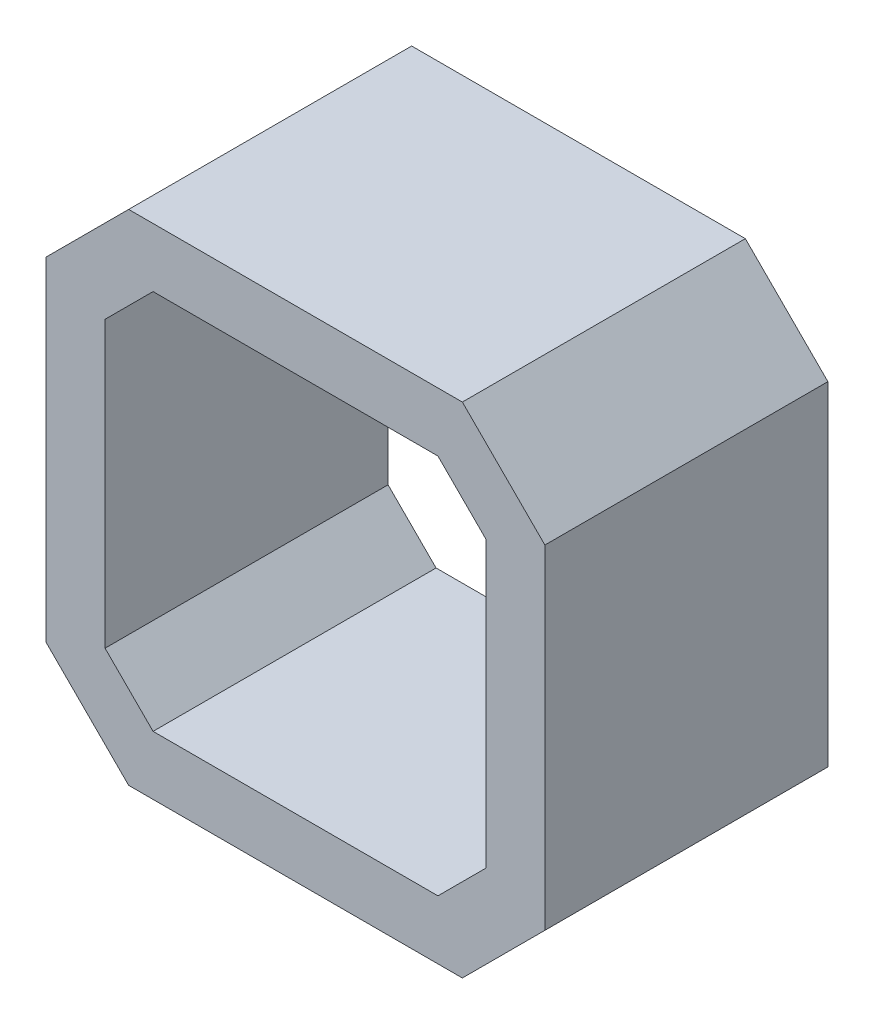
ISO-10303-21;
HEADER;
FILE_DESCRIPTION(('STEP AP214'),'2;1');
FILE_NAME('part.step','',(''),(''),'','','');
FILE_SCHEMA(('AUTOMOTIVE_DESIGN { 1 0 10303 214 1 1 1 1 }'));
ENDSEC;
DATA;
#1=APPLICATION_CONTEXT('core data for automotive mechanical design processes');
#2=APPLICATION_PROTOCOL_DEFINITION('international standard','automotive_design',2000,#1);
#3=PRODUCT_CONTEXT('',#1,'mechanical');
#4=PRODUCT('Part','Part','',(#3));
#5=PRODUCT_RELATED_PRODUCT_CATEGORY('part','',(#4));
#6=PRODUCT_DEFINITION_FORMATION('','',#4);
#7=PRODUCT_DEFINITION_CONTEXT('part definition',#1,'design');
#8=PRODUCT_DEFINITION('design','',#6,#7);
#9=PRODUCT_DEFINITION_SHAPE('','',#8);
#10=(LENGTH_UNIT() NAMED_UNIT(*) SI_UNIT(.MILLI.,.METRE.));
#11=(NAMED_UNIT(*) PLANE_ANGLE_UNIT() SI_UNIT($,.RADIAN.));
#12=(NAMED_UNIT(*) SI_UNIT($,.STERADIAN.) SOLID_ANGLE_UNIT());
#13=UNCERTAINTY_MEASURE_WITH_UNIT(LENGTH_MEASURE(1.E-05),#10,'distance_accuracy_value','');
#14=(GEOMETRIC_REPRESENTATION_CONTEXT(3) GLOBAL_UNCERTAINTY_ASSIGNED_CONTEXT((#13)) GLOBAL_UNIT_ASSIGNED_CONTEXT((#10,
#11,#12)) REPRESENTATION_CONTEXT('',''));
#15=CARTESIAN_POINT('',(0.,0.,0.));
#16=DIRECTION('',(0.,0.,1.));
#17=DIRECTION('',(1.,0.,0.));
#18=AXIS2_PLACEMENT_3D('',#15,#16,#17);
#19=CARTESIAN_POINT('',(0.,0.,24.));
#20=DIRECTION('',(0.,0.,-1.));
#21=DIRECTION('',(-1.,0.,0.));
#22=AXIS2_PLACEMENT_3D('',#19,#20,#21);
#23=PLANE('',#22);
#24=DIRECTION('',(-1.,0.,0.));
#25=VECTOR('',#24,1.);
#26=CARTESIAN_POINT('',(-14.15,21.15,24.));
#27=LINE('',#26,#25);
#28=CARTESIAN_POINT('',(14.15,21.15,24.));
#29=VERTEX_POINT('',#28);
#30=CARTESIAN_POINT('',(-14.15,21.15,24.));
#31=VERTEX_POINT('',#30);
#32=EDGE_CURVE('E236',#29,#31,#27,.T.);
#33=ORIENTED_EDGE('',*,*,#32,.T.);
#34=DIRECTION('',(-0.707106781186547,-0.707106781186547,0.));
#35=VECTOR('',#34,1.);
#36=CARTESIAN_POINT('',(-21.15,14.15,24.));
#37=LINE('',#36,#35);
#38=CARTESIAN_POINT('',(-21.15,14.15,24.));
#39=VERTEX_POINT('',#38);
#40=EDGE_CURVE('E240',#31,#39,#37,.T.);
#41=ORIENTED_EDGE('',*,*,#40,.T.);
#42=DIRECTION('',(0.,-1.,0.));
#43=VECTOR('',#42,1.);
#44=CARTESIAN_POINT('',(-21.15,14.15,24.));
#45=LINE('',#44,#43);
#46=CARTESIAN_POINT('',(-21.15,-14.15,24.));
#47=VERTEX_POINT('',#46);
#48=EDGE_CURVE('E244',#39,#47,#45,.T.);
#49=ORIENTED_EDGE('',*,*,#48,.T.);
#50=DIRECTION('',(0.707106781186547,-0.707106781186547,0.));
#51=VECTOR('',#50,1.);
#52=CARTESIAN_POINT('',(-21.15,-14.15,24.));
#53=LINE('',#52,#51);
#54=CARTESIAN_POINT('',(-14.15,-21.15,24.));
#55=VERTEX_POINT('',#54);
#56=EDGE_CURVE('E247',#47,#55,#53,.T.);
#57=ORIENTED_EDGE('',*,*,#56,.T.);
#58=DIRECTION('',(1.,0.,0.));
#59=VECTOR('',#58,1.);
#60=CARTESIAN_POINT('',(-14.15,-21.15,24.));
#61=LINE('',#60,#59);
#62=CARTESIAN_POINT('',(14.15,-21.15,24.));
#63=VERTEX_POINT('',#62);
#64=EDGE_CURVE('E250',#55,#63,#61,.T.);
#65=ORIENTED_EDGE('',*,*,#64,.T.);
#66=DIRECTION('',(0.707106781186547,0.707106781186547,0.));
#67=VECTOR('',#66,1.);
#68=CARTESIAN_POINT('',(14.15,-21.15,24.));
#69=LINE('',#68,#67);
#70=CARTESIAN_POINT('',(21.15,-14.15,24.));
#71=VERTEX_POINT('',#70);
#72=EDGE_CURVE('E253',#63,#71,#69,.T.);
#73=ORIENTED_EDGE('',*,*,#72,.T.);
#74=DIRECTION('',(0.,1.,0.));
#75=VECTOR('',#74,1.);
#76=CARTESIAN_POINT('',(21.15,14.15,24.));
#77=LINE('',#76,#75);
#78=CARTESIAN_POINT('',(21.15,14.15,24.));
#79=VERTEX_POINT('',#78);
#80=EDGE_CURVE('E256',#71,#79,#77,.T.);
#81=ORIENTED_EDGE('',*,*,#80,.T.);
#82=DIRECTION('',(-0.707106781186547,0.707106781186547,0.));
#83=VECTOR('',#82,1.);
#84=CARTESIAN_POINT('',(14.15,21.15,24.));
#85=LINE('',#84,#83);
#86=EDGE_CURVE('E259',#79,#29,#85,.T.);
#87=ORIENTED_EDGE('',*,*,#86,.T.);
#88=EDGE_LOOP('',(#33,#41,#49,#57,#65,#73,#81,#87));
#89=FACE_BOUND('',#88,.T.);
#90=DIRECTION('',(-0.707106781186547,-0.707106781186547,0.));
#91=VECTOR('',#90,1.);
#92=CARTESIAN_POINT('',(-16.15,12.0789321881345,24.));
#93=LINE('',#92,#91);
#94=CARTESIAN_POINT('',(-12.0789321881345,16.15,24.));
#95=VERTEX_POINT('',#94);
#96=CARTESIAN_POINT('',(-16.15,12.0789321881345,24.));
#97=VERTEX_POINT('',#96);
#98=EDGE_CURVE('E146',#95,#97,#93,.T.);
#99=ORIENTED_EDGE('',*,*,#98,.F.);
#100=DIRECTION('',(-1.,0.,0.));
#101=VECTOR('',#100,1.);
#102=CARTESIAN_POINT('',(-12.0789321881345,16.15,24.));
#103=LINE('',#102,#101);
#104=CARTESIAN_POINT('',(12.0789321881345,16.15,24.));
#105=VERTEX_POINT('',#104);
#106=EDGE_CURVE('E188',#105,#95,#103,.T.);
#107=ORIENTED_EDGE('',*,*,#106,.F.);
#108=DIRECTION('',(-0.707106781186547,0.707106781186547,0.));
#109=VECTOR('',#108,1.);
#110=CARTESIAN_POINT('',(12.0789321881345,16.15,24.));
#111=LINE('',#110,#109);
#112=CARTESIAN_POINT('',(16.15,12.0789321881345,24.));
#113=VERTEX_POINT('',#112);
#114=EDGE_CURVE('E185',#113,#105,#111,.T.);
#115=ORIENTED_EDGE('',*,*,#114,.F.);
#116=DIRECTION('',(0.,1.,0.));
#117=VECTOR('',#116,1.);
#118=CARTESIAN_POINT('',(16.15,12.0789321881345,24.));
#119=LINE('',#118,#117);
#120=CARTESIAN_POINT('',(16.15,-12.0789321881345,24.));
#121=VERTEX_POINT('',#120);
#122=EDGE_CURVE('E182',#121,#113,#119,.T.);
#123=ORIENTED_EDGE('',*,*,#122,.F.);
#124=DIRECTION('',(0.707106781186548,0.707106781186548,0.));
#125=VECTOR('',#124,1.);
#126=CARTESIAN_POINT('',(12.0789321881345,-16.15,24.));
#127=LINE('',#126,#125);
#128=CARTESIAN_POINT('',(12.0789321881345,-16.15,24.));
#129=VERTEX_POINT('',#128);
#130=EDGE_CURVE('E179',#129,#121,#127,.T.);
#131=ORIENTED_EDGE('',*,*,#130,.F.);
#132=DIRECTION('',(1.,0.,0.));
#133=VECTOR('',#132,1.);
#134=CARTESIAN_POINT('',(-12.0789321881345,-16.15,24.));
#135=LINE('',#134,#133);
#136=CARTESIAN_POINT('',(-12.0789321881345,-16.15,24.));
#137=VERTEX_POINT('',#136);
#138=EDGE_CURVE('E174',#137,#129,#135,.T.);
#139=ORIENTED_EDGE('',*,*,#138,.F.);
#140=DIRECTION('',(0.707106781186548,-0.707106781186548,0.));
#141=VECTOR('',#140,1.);
#142=CARTESIAN_POINT('',(-16.15,-12.0789321881345,24.));
#143=LINE('',#142,#141);
#144=CARTESIAN_POINT('',(-16.15,-12.0789321881345,24.));
#145=VERTEX_POINT('',#144);
#146=EDGE_CURVE('E169',#145,#137,#143,.T.);
#147=ORIENTED_EDGE('',*,*,#146,.F.);
#148=DIRECTION('',(0.,-1.,0.));
#149=VECTOR('',#148,1.);
#150=CARTESIAN_POINT('',(-16.15,12.0789321881345,24.));
#151=LINE('',#150,#149);
#152=EDGE_CURVE('E155',#97,#145,#151,.T.);
#153=ORIENTED_EDGE('',*,*,#152,.F.);
#154=EDGE_LOOP('',(#99,#107,#115,#123,#131,#139,#147,#153));
#155=FACE_BOUND('',#154,.T.);
#156=ADVANCED_FACE('F32',(#89,#155),#23,.F.);
#157=CARTESIAN_POINT('',(0.,0.,0.));
#158=DIRECTION('',(0.,0.,-1.));
#159=DIRECTION('',(-1.,0.,0.));
#160=AXIS2_PLACEMENT_3D('',#157,#158,#159);
#161=PLANE('',#160);
#162=DIRECTION('',(-1.,0.,0.));
#163=VECTOR('',#162,1.);
#164=CARTESIAN_POINT('',(-14.15,21.15,0.));
#165=LINE('',#164,#163);
#166=CARTESIAN_POINT('',(14.15,21.15,0.));
#167=VERTEX_POINT('',#166);
#168=CARTESIAN_POINT('',(-14.15,21.15,0.));
#169=VERTEX_POINT('',#168);
#170=EDGE_CURVE('E164',#167,#169,#165,.T.);
#171=ORIENTED_EDGE('',*,*,#170,.F.);
#172=DIRECTION('',(-0.707106781186547,0.707106781186547,0.));
#173=VECTOR('',#172,1.);
#174=CARTESIAN_POINT('',(14.15,21.15,0.));
#175=LINE('',#174,#173);
#176=CARTESIAN_POINT('',(21.15,14.15,0.));
#177=VERTEX_POINT('',#176);
#178=EDGE_CURVE('E241',#177,#167,#175,.T.);
#179=ORIENTED_EDGE('',*,*,#178,.F.);
#180=DIRECTION('',(0.,1.,0.));
#181=VECTOR('',#180,1.);
#182=CARTESIAN_POINT('',(21.15,14.15,0.));
#183=LINE('',#182,#181);
#184=CARTESIAN_POINT('',(21.15,-14.15,0.));
#185=VERTEX_POINT('',#184);
#186=EDGE_CURVE('E281',#185,#177,#183,.T.);
#187=ORIENTED_EDGE('',*,*,#186,.F.);
#188=DIRECTION('',(0.707106781186547,0.707106781186547,0.));
#189=VECTOR('',#188,1.);
#190=CARTESIAN_POINT('',(14.15,-21.15,0.));
#191=LINE('',#190,#189);
#192=CARTESIAN_POINT('',(14.15,-21.15,0.));
#193=VERTEX_POINT('',#192);
#194=EDGE_CURVE('E278',#193,#185,#191,.T.);
#195=ORIENTED_EDGE('',*,*,#194,.F.);
#196=DIRECTION('',(1.,0.,0.));
#197=VECTOR('',#196,1.);
#198=CARTESIAN_POINT('',(-14.15,-21.15,0.));
#199=LINE('',#198,#197);
#200=CARTESIAN_POINT('',(-14.15,-21.15,0.));
#201=VERTEX_POINT('',#200);
#202=EDGE_CURVE('E275',#201,#193,#199,.T.);
#203=ORIENTED_EDGE('',*,*,#202,.F.);
#204=DIRECTION('',(0.707106781186547,-0.707106781186547,0.));
#205=VECTOR('',#204,1.);
#206=CARTESIAN_POINT('',(-21.15,-14.15,0.));
#207=LINE('',#206,#205);
#208=CARTESIAN_POINT('',(-21.15,-14.15,0.));
#209=VERTEX_POINT('',#208);
#210=EDGE_CURVE('E272',#209,#201,#207,.T.);
#211=ORIENTED_EDGE('',*,*,#210,.F.);
#212=DIRECTION('',(0.,-1.,0.));
#213=VECTOR('',#212,1.);
#214=CARTESIAN_POINT('',(-21.15,14.15,0.));
#215=LINE('',#214,#213);
#216=CARTESIAN_POINT('',(-21.15,14.15,0.));
#217=VERTEX_POINT('',#216);
#218=EDGE_CURVE('E269',#217,#209,#215,.T.);
#219=ORIENTED_EDGE('',*,*,#218,.F.);
#220=DIRECTION('',(-0.707106781186547,-0.707106781186547,0.));
#221=VECTOR('',#220,1.);
#222=CARTESIAN_POINT('',(-21.15,14.15,0.));
#223=LINE('',#222,#221);
#224=EDGE_CURVE('E266',#169,#217,#223,.T.);
#225=ORIENTED_EDGE('',*,*,#224,.F.);
#226=EDGE_LOOP('',(#171,#179,#187,#195,#203,#211,#219,#225));
#227=FACE_BOUND('',#226,.T.);
#228=DIRECTION('',(-1.,0.,0.));
#229=VECTOR('',#228,1.);
#230=CARTESIAN_POINT('',(-12.0789321881345,16.15,0.));
#231=LINE('',#230,#229);
#232=CARTESIAN_POINT('',(12.0789321881345,16.15,0.));
#233=VERTEX_POINT('',#232);
#234=CARTESIAN_POINT('',(-12.0789321881345,16.15,0.));
#235=VERTEX_POINT('',#234);
#236=EDGE_CURVE('E156',#233,#235,#231,.T.);
#237=ORIENTED_EDGE('',*,*,#236,.T.);
#238=DIRECTION('',(-0.707106781186547,-0.707106781186547,0.));
#239=VECTOR('',#238,1.);
#240=CARTESIAN_POINT('',(-16.15,12.0789321881345,0.));
#241=LINE('',#240,#239);
#242=CARTESIAN_POINT('',(-16.15,12.0789321881345,0.));
#243=VERTEX_POINT('',#242);
#244=EDGE_CURVE('E56',#235,#243,#241,.T.);
#245=ORIENTED_EDGE('',*,*,#244,.T.);
#246=DIRECTION('',(0.,-1.,0.));
#247=VECTOR('',#246,1.);
#248=CARTESIAN_POINT('',(-16.15,12.0789321881345,0.));
#249=LINE('',#248,#247);
#250=CARTESIAN_POINT('',(-16.15,-12.0789321881345,0.));
#251=VERTEX_POINT('',#250);
#252=EDGE_CURVE('E162',#243,#251,#249,.T.);
#253=ORIENTED_EDGE('',*,*,#252,.T.);
#254=DIRECTION('',(0.707106781186548,-0.707106781186548,0.));
#255=VECTOR('',#254,1.);
#256=CARTESIAN_POINT('',(-16.15,-12.0789321881345,0.));
#257=LINE('',#256,#255);
#258=CARTESIAN_POINT('',(-12.0789321881345,-16.15,0.));
#259=VERTEX_POINT('',#258);
#260=EDGE_CURVE('E195',#251,#259,#257,.T.);
#261=ORIENTED_EDGE('',*,*,#260,.T.);
#262=DIRECTION('',(1.,0.,0.));
#263=VECTOR('',#262,1.);
#264=CARTESIAN_POINT('',(-12.0789321881345,-16.15,0.));
#265=LINE('',#264,#263);
#266=CARTESIAN_POINT('',(12.0789321881345,-16.15,0.));
#267=VERTEX_POINT('',#266);
#268=EDGE_CURVE('E199',#259,#267,#265,.T.);
#269=ORIENTED_EDGE('',*,*,#268,.T.);
#270=DIRECTION('',(0.707106781186548,0.707106781186548,0.));
#271=VECTOR('',#270,1.);
#272=CARTESIAN_POINT('',(12.0789321881345,-16.15,0.));
#273=LINE('',#272,#271);
#274=CARTESIAN_POINT('',(16.15,-12.0789321881345,0.));
#275=VERTEX_POINT('',#274);
#276=EDGE_CURVE('E203',#267,#275,#273,.T.);
#277=ORIENTED_EDGE('',*,*,#276,.T.);
#278=DIRECTION('',(0.,1.,0.));
#279=VECTOR('',#278,1.);
#280=CARTESIAN_POINT('',(16.15,12.0789321881345,0.));
#281=LINE('',#280,#279);
#282=CARTESIAN_POINT('',(16.15,12.0789321881345,0.));
#283=VERTEX_POINT('',#282);
#284=EDGE_CURVE('E207',#275,#283,#281,.T.);
#285=ORIENTED_EDGE('',*,*,#284,.T.);
#286=DIRECTION('',(-0.707106781186547,0.707106781186547,0.));
#287=VECTOR('',#286,1.);
#288=CARTESIAN_POINT('',(12.0789321881345,16.15,0.));
#289=LINE('',#288,#287);
#290=EDGE_CURVE('E211',#283,#233,#289,.T.);
#291=ORIENTED_EDGE('',*,*,#290,.T.);
#292=EDGE_LOOP('',(#237,#245,#253,#261,#269,#277,#285,#291));
#293=FACE_BOUND('',#292,.T.);
#294=ADVANCED_FACE('F321',(#227,#293),#161,.T.);
#295=CARTESIAN_POINT('',(-14.15,21.15,24.));
#296=DIRECTION('',(0.,-1.,0.));
#297=DIRECTION('',(0.,0.,-1.));
#298=AXIS2_PLACEMENT_3D('',#295,#296,#297);
#299=PLANE('',#298);
#300=ORIENTED_EDGE('',*,*,#170,.T.);
#301=DIRECTION('',(0.,0.,-1.));
#302=VECTOR('',#301,1.);
#303=CARTESIAN_POINT('',(-14.15,21.15,24.));
#304=LINE('',#303,#302);
#305=EDGE_CURVE('E11',#31,#169,#304,.T.);
#306=ORIENTED_EDGE('',*,*,#305,.F.);
#307=ORIENTED_EDGE('',*,*,#32,.F.);
#308=DIRECTION('',(0.,0.,-1.));
#309=VECTOR('',#308,1.);
#310=CARTESIAN_POINT('',(14.15,21.15,24.));
#311=LINE('',#310,#309);
#312=EDGE_CURVE('E262',#29,#167,#311,.T.);
#313=ORIENTED_EDGE('',*,*,#312,.T.);
#314=EDGE_LOOP('',(#300,#306,#307,#313));
#315=FACE_BOUND('',#314,.T.);
#316=ADVANCED_FACE('F34',(#315),#299,.F.);
#317=CARTESIAN_POINT('',(-21.15,14.15,24.));
#318=DIRECTION('',(0.707106781186548,-0.707106781186548,0.));
#319=DIRECTION('',(0.707106781186548,0.707106781186548,0.));
#320=AXIS2_PLACEMENT_3D('',#317,#318,#319);
#321=PLANE('',#320);
#322=ORIENTED_EDGE('',*,*,#224,.T.);
#323=DIRECTION('',(0.,0.,-1.));
#324=VECTOR('',#323,1.);
#325=CARTESIAN_POINT('',(-21.15,14.15,24.));
#326=LINE('',#325,#324);
#327=EDGE_CURVE('E41',#39,#217,#326,.T.);
#328=ORIENTED_EDGE('',*,*,#327,.F.);
#329=ORIENTED_EDGE('',*,*,#40,.F.);
#330=ORIENTED_EDGE('',*,*,#305,.T.);
#331=EDGE_LOOP('',(#322,#328,#329,#330));
#332=FACE_BOUND('',#331,.T.);
#333=ADVANCED_FACE('F338',(#332),#321,.F.);
#334=CARTESIAN_POINT('',(-21.15,14.15,24.));
#335=DIRECTION('',(1.,0.,0.));
#336=DIRECTION('',(0.,1.,0.));
#337=AXIS2_PLACEMENT_3D('',#334,#335,#336);
#338=PLANE('',#337);
#339=ORIENTED_EDGE('',*,*,#218,.T.);
#340=DIRECTION('',(0.,0.,-1.));
#341=VECTOR('',#340,1.);
#342=CARTESIAN_POINT('',(-21.15,-14.15,24.));
#343=LINE('',#342,#341);
#344=EDGE_CURVE('E305',#47,#209,#343,.T.);
#345=ORIENTED_EDGE('',*,*,#344,.F.);
#346=ORIENTED_EDGE('',*,*,#48,.F.);
#347=ORIENTED_EDGE('',*,*,#327,.T.);
#348=EDGE_LOOP('',(#339,#345,#346,#347));
#349=FACE_BOUND('',#348,.T.);
#350=ADVANCED_FACE('F315',(#349),#338,.F.);
#351=CARTESIAN_POINT('',(-21.15,-14.15,24.));
#352=DIRECTION('',(0.707106781186548,0.707106781186548,0.));
#353=DIRECTION('',(-0.707106781186548,0.707106781186548,0.));
#354=AXIS2_PLACEMENT_3D('',#351,#352,#353);
#355=PLANE('',#354);
#356=ORIENTED_EDGE('',*,*,#210,.T.);
#357=DIRECTION('',(0.,0.,-1.));
#358=VECTOR('',#357,1.);
#359=CARTESIAN_POINT('',(-14.15,-21.15,24.));
#360=LINE('',#359,#358);
#361=EDGE_CURVE('E301',#55,#201,#360,.T.);
#362=ORIENTED_EDGE('',*,*,#361,.F.);
#363=ORIENTED_EDGE('',*,*,#56,.F.);
#364=ORIENTED_EDGE('',*,*,#344,.T.);
#365=EDGE_LOOP('',(#356,#362,#363,#364));
#366=FACE_BOUND('',#365,.T.);
#367=ADVANCED_FACE('F327',(#366),#355,.F.);
#368=CARTESIAN_POINT('',(-14.15,-21.15,24.));
#369=DIRECTION('',(0.,1.,0.));
#370=DIRECTION('',(0.,0.,1.));
#371=AXIS2_PLACEMENT_3D('',#368,#369,#370);
#372=PLANE('',#371);
#373=ORIENTED_EDGE('',*,*,#202,.T.);
#374=DIRECTION('',(0.,0.,-1.));
#375=VECTOR('',#374,1.);
#376=CARTESIAN_POINT('',(14.15,-21.15,24.));
#377=LINE('',#376,#375);
#378=EDGE_CURVE('E297',#63,#193,#377,.T.);
#379=ORIENTED_EDGE('',*,*,#378,.F.);
#380=ORIENTED_EDGE('',*,*,#64,.F.);
#381=ORIENTED_EDGE('',*,*,#361,.T.);
#382=EDGE_LOOP('',(#373,#379,#380,#381));
#383=FACE_BOUND('',#382,.T.);
#384=ADVANCED_FACE('F331',(#383),#372,.F.);
#385=CARTESIAN_POINT('',(14.15,-21.15,24.));
#386=DIRECTION('',(-0.707106781186548,0.707106781186548,0.));
#387=DIRECTION('',(-0.707106781186548,-0.707106781186548,0.));
#388=AXIS2_PLACEMENT_3D('',#385,#386,#387);
#389=PLANE('',#388);
#390=ORIENTED_EDGE('',*,*,#194,.T.);
#391=DIRECTION('',(0.,0.,-1.));
#392=VECTOR('',#391,1.);
#393=CARTESIAN_POINT('',(21.15,-14.15,24.));
#394=LINE('',#393,#392);
#395=EDGE_CURVE('E293',#71,#185,#394,.T.);
#396=ORIENTED_EDGE('',*,*,#395,.F.);
#397=ORIENTED_EDGE('',*,*,#72,.F.);
#398=ORIENTED_EDGE('',*,*,#378,.T.);
#399=EDGE_LOOP('',(#390,#396,#397,#398));
#400=FACE_BOUND('',#399,.T.);
#401=ADVANCED_FACE('F351',(#400),#389,.F.);
#402=CARTESIAN_POINT('',(21.15,14.15,24.));
#403=DIRECTION('',(-1.,0.,0.));
#404=DIRECTION('',(0.,-1.,0.));
#405=AXIS2_PLACEMENT_3D('',#402,#403,#404);
#406=PLANE('',#405);
#407=ORIENTED_EDGE('',*,*,#186,.T.);
#408=DIRECTION('',(0.,0.,-1.));
#409=VECTOR('',#408,1.);
#410=CARTESIAN_POINT('',(21.15,14.15,24.));
#411=LINE('',#410,#409);
#412=EDGE_CURVE('E289',#79,#177,#411,.T.);
#413=ORIENTED_EDGE('',*,*,#412,.F.);
#414=ORIENTED_EDGE('',*,*,#80,.F.);
#415=ORIENTED_EDGE('',*,*,#395,.T.);
#416=EDGE_LOOP('',(#407,#413,#414,#415));
#417=FACE_BOUND('',#416,.T.);
#418=ADVANCED_FACE('F349',(#417),#406,.F.);
#419=CARTESIAN_POINT('',(14.15,21.15,24.));
#420=DIRECTION('',(-0.707106781186548,-0.707106781186548,0.));
#421=DIRECTION('',(0.707106781186548,-0.707106781186548,0.));
#422=AXIS2_PLACEMENT_3D('',#419,#420,#421);
#423=PLANE('',#422);
#424=ORIENTED_EDGE('',*,*,#178,.T.);
#425=ORIENTED_EDGE('',*,*,#312,.F.);
#426=ORIENTED_EDGE('',*,*,#86,.F.);
#427=ORIENTED_EDGE('',*,*,#412,.T.);
#428=EDGE_LOOP('',(#424,#425,#426,#427));
#429=FACE_BOUND('',#428,.T.);
#430=ADVANCED_FACE('F344',(#429),#423,.F.);
#431=CARTESIAN_POINT('',(-16.15,12.0789321881345,24.));
#432=DIRECTION('',(0.707106781186548,-0.707106781186548,0.));
#433=DIRECTION('',(0.707106781186548,0.707106781186548,0.));
#434=AXIS2_PLACEMENT_3D('',#431,#432,#433);
#435=PLANE('',#434);
#436=ORIENTED_EDGE('',*,*,#244,.F.);
#437=DIRECTION('',(0.,0.,-1.));
#438=VECTOR('',#437,1.);
#439=CARTESIAN_POINT('',(-12.0789321881345,16.15,24.));
#440=LINE('',#439,#438);
#441=EDGE_CURVE('E150',#95,#235,#440,.T.);
#442=ORIENTED_EDGE('',*,*,#441,.F.);
#443=ORIENTED_EDGE('',*,*,#98,.T.);
#444=DIRECTION('',(0.,0.,-1.));
#445=VECTOR('',#444,1.);
#446=CARTESIAN_POINT('',(-16.15,12.0789321881345,24.));
#447=LINE('',#446,#445);
#448=EDGE_CURVE('E149',#97,#243,#447,.T.);
#449=ORIENTED_EDGE('',*,*,#448,.T.);
#450=EDGE_LOOP('',(#436,#442,#443,#449));
#451=FACE_BOUND('',#450,.T.);
#452=ADVANCED_FACE('F148',(#451),#435,.T.);
#453=CARTESIAN_POINT('',(-16.15,12.0789321881345,24.));
#454=DIRECTION('',(1.,0.,0.));
#455=DIRECTION('',(0.,0.,-1.));
#456=AXIS2_PLACEMENT_3D('',#453,#454,#455);
#457=PLANE('',#456);
#458=ORIENTED_EDGE('',*,*,#252,.F.);
#459=ORIENTED_EDGE('',*,*,#448,.F.);
#460=ORIENTED_EDGE('',*,*,#152,.T.);
#461=DIRECTION('',(0.,0.,-1.));
#462=VECTOR('',#461,1.);
#463=CARTESIAN_POINT('',(-16.15,-12.0789321881345,24.));
#464=LINE('',#463,#462);
#465=EDGE_CURVE('E165',#145,#251,#464,.T.);
#466=ORIENTED_EDGE('',*,*,#465,.T.);
#467=EDGE_LOOP('',(#458,#459,#460,#466));
#468=FACE_BOUND('',#467,.T.);
#469=ADVANCED_FACE('F159',(#468),#457,.T.);
#470=CARTESIAN_POINT('',(-16.15,-12.0789321881345,24.));
#471=DIRECTION('',(0.707106781186547,0.707106781186547,0.));
#472=DIRECTION('',(-0.707106781186548,0.707106781186548,0.));
#473=AXIS2_PLACEMENT_3D('',#470,#471,#472);
#474=PLANE('',#473);
#475=ORIENTED_EDGE('',*,*,#260,.F.);
#476=ORIENTED_EDGE('',*,*,#465,.F.);
#477=ORIENTED_EDGE('',*,*,#146,.T.);
#478=DIRECTION('',(0.,0.,-1.));
#479=VECTOR('',#478,1.);
#480=CARTESIAN_POINT('',(-12.0789321881345,-16.15,24.));
#481=LINE('',#480,#479);
#482=EDGE_CURVE('E231',#137,#259,#481,.T.);
#483=ORIENTED_EDGE('',*,*,#482,.T.);
#484=EDGE_LOOP('',(#475,#476,#477,#483));
#485=FACE_BOUND('',#484,.T.);
#486=ADVANCED_FACE('F376',(#485),#474,.T.);
#487=CARTESIAN_POINT('',(-12.0789321881345,-16.15,24.));
#488=DIRECTION('',(0.,1.,0.));
#489=DIRECTION('',(0.,0.,1.));
#490=AXIS2_PLACEMENT_3D('',#487,#488,#489);
#491=PLANE('',#490);
#492=ORIENTED_EDGE('',*,*,#268,.F.);
#493=ORIENTED_EDGE('',*,*,#482,.F.);
#494=ORIENTED_EDGE('',*,*,#138,.T.);
#495=DIRECTION('',(0.,0.,-1.));
#496=VECTOR('',#495,1.);
#497=CARTESIAN_POINT('',(12.0789321881345,-16.15,24.));
#498=LINE('',#497,#496);
#499=EDGE_CURVE('E228',#129,#267,#498,.T.);
#500=ORIENTED_EDGE('',*,*,#499,.T.);
#501=EDGE_LOOP('',(#492,#493,#494,#500));
#502=FACE_BOUND('',#501,.T.);
#503=ADVANCED_FACE('F380',(#502),#491,.T.);
#504=CARTESIAN_POINT('',(12.0789321881345,-16.15,24.));
#505=DIRECTION('',(-0.707106781186547,0.707106781186547,0.));
#506=DIRECTION('',(-0.707106781186548,-0.707106781186548,0.));
#507=AXIS2_PLACEMENT_3D('',#504,#505,#506);
#508=PLANE('',#507);
#509=ORIENTED_EDGE('',*,*,#276,.F.);
#510=ORIENTED_EDGE('',*,*,#499,.F.);
#511=ORIENTED_EDGE('',*,*,#130,.T.);
#512=DIRECTION('',(0.,0.,-1.));
#513=VECTOR('',#512,1.);
#514=CARTESIAN_POINT('',(16.15,-12.0789321881345,24.));
#515=LINE('',#514,#513);
#516=EDGE_CURVE('E225',#121,#275,#515,.T.);
#517=ORIENTED_EDGE('',*,*,#516,.T.);
#518=EDGE_LOOP('',(#509,#510,#511,#517));
#519=FACE_BOUND('',#518,.T.);
#520=ADVANCED_FACE('F386',(#519),#508,.T.);
#521=CARTESIAN_POINT('',(16.15,12.0789321881345,24.));
#522=DIRECTION('',(-1.,0.,0.));
#523=DIRECTION('',(0.,0.,1.));
#524=AXIS2_PLACEMENT_3D('',#521,#522,#523);
#525=PLANE('',#524);
#526=ORIENTED_EDGE('',*,*,#284,.F.);
#527=ORIENTED_EDGE('',*,*,#516,.F.);
#528=ORIENTED_EDGE('',*,*,#122,.T.);
#529=DIRECTION('',(0.,0.,-1.));
#530=VECTOR('',#529,1.);
#531=CARTESIAN_POINT('',(16.15,12.0789321881345,24.));
#532=LINE('',#531,#530);
#533=EDGE_CURVE('E222',#113,#283,#532,.T.);
#534=ORIENTED_EDGE('',*,*,#533,.T.);
#535=EDGE_LOOP('',(#526,#527,#528,#534));
#536=FACE_BOUND('',#535,.T.);
#537=ADVANCED_FACE('F390',(#536),#525,.T.);
#538=CARTESIAN_POINT('',(12.0789321881345,16.15,24.));
#539=DIRECTION('',(-0.707106781186548,-0.707106781186548,0.));
#540=DIRECTION('',(0.707106781186548,-0.707106781186548,0.));
#541=AXIS2_PLACEMENT_3D('',#538,#539,#540);
#542=PLANE('',#541);
#543=ORIENTED_EDGE('',*,*,#290,.F.);
#544=ORIENTED_EDGE('',*,*,#533,.F.);
#545=ORIENTED_EDGE('',*,*,#114,.T.);
#546=DIRECTION('',(0.,0.,-1.));
#547=VECTOR('',#546,1.);
#548=CARTESIAN_POINT('',(12.0789321881345,16.15,24.));
#549=LINE('',#548,#547);
#550=EDGE_CURVE('E48',#105,#233,#549,.T.);
#551=ORIENTED_EDGE('',*,*,#550,.T.);
#552=EDGE_LOOP('',(#543,#544,#545,#551));
#553=FACE_BOUND('',#552,.T.);
#554=ADVANCED_FACE('F394',(#553),#542,.T.);
#555=CARTESIAN_POINT('',(-12.0789321881345,16.15,24.));
#556=DIRECTION('',(0.,-1.,0.));
#557=DIRECTION('',(0.,0.,-1.));
#558=AXIS2_PLACEMENT_3D('',#555,#556,#557);
#559=PLANE('',#558);
#560=ORIENTED_EDGE('',*,*,#236,.F.);
#561=ORIENTED_EDGE('',*,*,#550,.F.);
#562=ORIENTED_EDGE('',*,*,#106,.T.);
#563=ORIENTED_EDGE('',*,*,#441,.T.);
#564=EDGE_LOOP('',(#560,#561,#562,#563));
#565=FACE_BOUND('',#564,.T.);
#566=ADVANCED_FACE('F398',(#565),#559,.T.);
#567=CLOSED_SHELL('',(#156,#294,#316,#333,#350,#367,#384,#401,#418,#430,#452,#469,#486,#503,
#520,#537,#554,#566));
#568=MANIFOLD_SOLID_BREP('B2',#567);
#569=ADVANCED_BREP_SHAPE_REPRESENTATION('',(#18,#568),#14);
#570=SHAPE_DEFINITION_REPRESENTATION(#9,#569);
ENDSEC;
END-ISO-10303-21;
